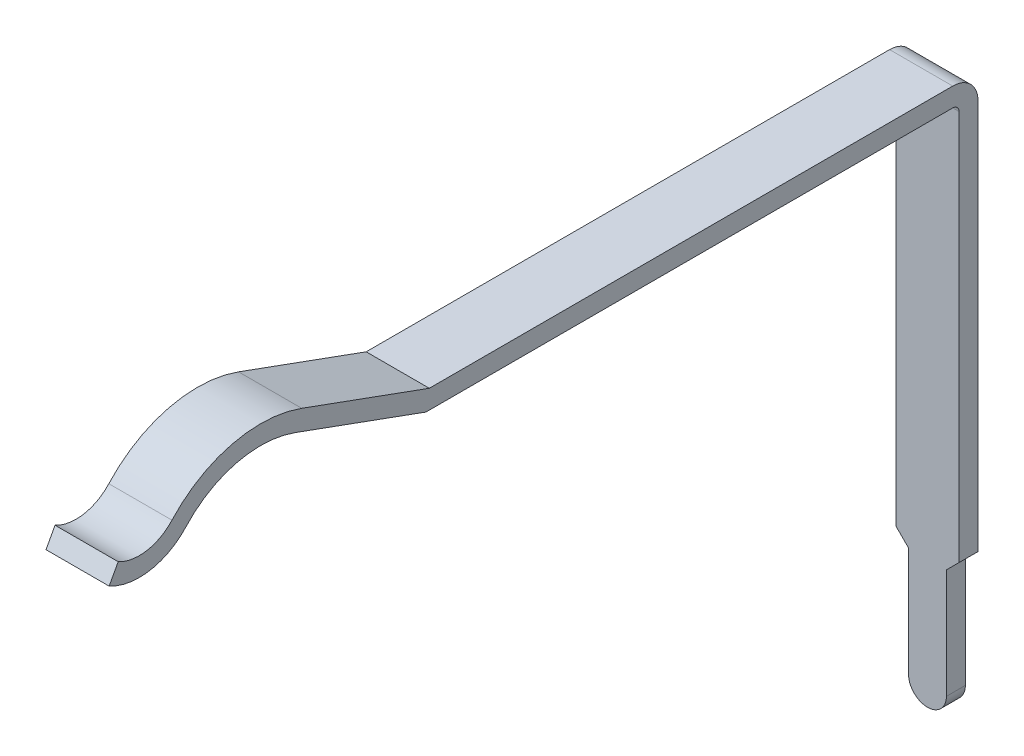
ISO-10303-21;
HEADER;
FILE_DESCRIPTION(('STEP AP214'),'2;1');
FILE_NAME('part.step','',(''),(''),'','','');
FILE_SCHEMA(('AUTOMOTIVE_DESIGN { 1 0 10303 214 1 1 1 1 }'));
ENDSEC;
DATA;
#1=APPLICATION_CONTEXT('core data for automotive mechanical design processes');
#2=APPLICATION_PROTOCOL_DEFINITION('international standard','automotive_design',2000,#1);
#3=PRODUCT_CONTEXT('',#1,'mechanical');
#4=PRODUCT('Part','Part','',(#3));
#5=PRODUCT_RELATED_PRODUCT_CATEGORY('part','',(#4));
#6=PRODUCT_DEFINITION_FORMATION('','',#4);
#7=PRODUCT_DEFINITION_CONTEXT('part definition',#1,'design');
#8=PRODUCT_DEFINITION('design','',#6,#7);
#9=PRODUCT_DEFINITION_SHAPE('','',#8);
#10=(LENGTH_UNIT() NAMED_UNIT(*) SI_UNIT(.MILLI.,.METRE.));
#11=(NAMED_UNIT(*) PLANE_ANGLE_UNIT() SI_UNIT($,.RADIAN.));
#12=(NAMED_UNIT(*) SI_UNIT($,.STERADIAN.) SOLID_ANGLE_UNIT());
#13=UNCERTAINTY_MEASURE_WITH_UNIT(LENGTH_MEASURE(1.E-05),#10,'distance_accuracy_value','');
#14=(GEOMETRIC_REPRESENTATION_CONTEXT(3) GLOBAL_UNCERTAINTY_ASSIGNED_CONTEXT((#13)) GLOBAL_UNIT_ASSIGNED_CONTEXT((#10,
#11,#12)) REPRESENTATION_CONTEXT('',''));
#15=CARTESIAN_POINT('',(0.,0.,0.));
#16=DIRECTION('',(0.,0.,1.));
#17=DIRECTION('',(1.,0.,0.));
#18=AXIS2_PLACEMENT_3D('',#15,#16,#17);
#19=CARTESIAN_POINT('',(0.5,-0.1,-14.36));
#20=DIRECTION('',(-1.,0.,0.));
#21=DIRECTION('',(0.,0.,1.));
#22=AXIS2_PLACEMENT_3D('',#19,#20,#21);
#23=CYLINDRICAL_SURFACE('',#22,0.4);
#24=DIRECTION('',(-1.,0.,0.));
#25=VECTOR('',#24,1.);
#26=CARTESIAN_POINT('',(0.,0.3,-14.36));
#27=LINE('',#26,#25);
#28=CARTESIAN_POINT('',(0.5,0.300000000311151,-14.36));
#29=VERTEX_POINT('',#28);
#30=CARTESIAN_POINT('',(-0.5,0.300000000311151,-14.36));
#31=VERTEX_POINT('',#30);
#32=EDGE_CURVE('E11',#29,#31,#27,.T.);
#33=ORIENTED_EDGE('',*,*,#32,.F.);
#34=CARTESIAN_POINT('',(0.5,-0.1,-14.36));
#35=DIRECTION('',(1.,0.,0.));
#36=DIRECTION('',(0.,0.,1.));
#37=AXIS2_PLACEMENT_3D('',#34,#35,#36);
#38=CIRCLE('',#37,0.4);
#39=CARTESIAN_POINT('',(0.5,-0.1,-14.76));
#40=VERTEX_POINT('',#39);
#41=EDGE_CURVE('E238',#40,#29,#38,.T.);
#42=ORIENTED_EDGE('',*,*,#41,.F.);
#43=DIRECTION('',(1.,0.,0.));
#44=VECTOR('',#43,1.);
#45=CARTESIAN_POINT('',(0.,-0.1,-14.76));
#46=LINE('',#45,#44);
#47=CARTESIAN_POINT('',(-0.5,-0.1,-14.76));
#48=VERTEX_POINT('',#47);
#49=EDGE_CURVE('E276',#48,#40,#46,.T.);
#50=ORIENTED_EDGE('',*,*,#49,.F.);
#51=CARTESIAN_POINT('',(-0.5,-0.1,-14.36));
#52=DIRECTION('',(1.,0.,0.));
#53=DIRECTION('',(0.,0.,1.));
#54=AXIS2_PLACEMENT_3D('',#51,#52,#53);
#55=CIRCLE('',#54,0.4);
#56=EDGE_CURVE('E335',#48,#31,#55,.T.);
#57=ORIENTED_EDGE('',*,*,#56,.T.);
#58=EDGE_LOOP('',(#33,#42,#50,#57));
#59=FACE_BOUND('',#58,.T.);
#60=ADVANCED_FACE('F16',(#59),#23,.T.);
#61=CARTESIAN_POINT('',(-0.5,0.3,-14.36));
#62=DIRECTION('',(0.,1.,0.));
#63=DIRECTION('',(1.,0.,0.));
#64=AXIS2_PLACEMENT_3D('',#61,#62,#63);
#65=PLANE('',#64);
#66=DIRECTION('',(0.,0.,1.));
#67=VECTOR('',#66,1.);
#68=CARTESIAN_POINT('',(0.5,0.300000000622303,-7.83872));
#69=LINE('',#68,#67);
#70=CARTESIAN_POINT('',(0.5,0.300000000466727,-6.07037707311936));
#71=VERTEX_POINT('',#70);
#72=EDGE_CURVE('E233',#29,#71,#69,.T.);
#73=ORIENTED_EDGE('',*,*,#72,.F.);
#74=ORIENTED_EDGE('',*,*,#32,.T.);
#75=DIRECTION('',(0.,0.,1.));
#76=VECTOR('',#75,1.);
#77=CARTESIAN_POINT('',(-0.5,0.300000000622303,-7.83872));
#78=LINE('',#77,#76);
#79=CARTESIAN_POINT('',(-0.5,0.300000000311151,-6.07037706914512));
#80=VERTEX_POINT('',#79);
#81=EDGE_CURVE('E326',#31,#80,#78,.T.);
#82=ORIENTED_EDGE('',*,*,#81,.T.);
#83=DIRECTION('',(-1.,0.,0.));
#84=VECTOR('',#83,1.);
#85=CARTESIAN_POINT('',(0.,0.3,-6.07037707));
#86=LINE('',#85,#84);
#87=EDGE_CURVE('E27',#71,#80,#86,.T.);
#88=ORIENTED_EDGE('',*,*,#87,.F.);
#89=EDGE_LOOP('',(#73,#74,#82,#88));
#90=FACE_BOUND('',#89,.T.);
#91=ADVANCED_FACE('F720',(#90),#65,.T.);
#92=CARTESIAN_POINT('',(-0.5,0.3,-6.07037707));
#93=DIRECTION('',(0.,0.939692620883365,-0.342020143057909));
#94=DIRECTION('',(-1.,0.,0.));
#95=AXIS2_PLACEMENT_3D('',#92,#93,#94);
#96=PLANE('',#95);
#97=DIRECTION('',(0.,0.342020140746785,0.939692621724545));
#98=VECTOR('',#97,1.);
#99=CARTESIAN_POINT('',(0.5,0.300000000622303,-6.07037707623872));
#100=LINE('',#99,#98);
#101=CARTESIAN_POINT('',(0.5,1.03541597897149,-4.04983826915849));
#102=VERTEX_POINT('',#101);
#103=EDGE_CURVE('E237',#71,#102,#100,.T.);
#104=ORIENTED_EDGE('',*,*,#103,.F.);
#105=ORIENTED_EDGE('',*,*,#87,.T.);
#106=DIRECTION('',(0.,0.342020143057909,0.939692620883365));
#107=VECTOR('',#106,1.);
#108=CARTESIAN_POINT('',(-0.5,0.3,-6.07037707));
#109=LINE('',#108,#107);
#110=CARTESIAN_POINT('',(-0.5,1.03541597937978,-4.04983827179352));
#111=VERTEX_POINT('',#110);
#112=EDGE_CURVE('E322',#80,#111,#109,.T.);
#113=ORIENTED_EDGE('',*,*,#112,.T.);
#114=DIRECTION('',(1.,0.,0.));
#115=VECTOR('',#114,1.);
#116=CARTESIAN_POINT('',(0.,1.03541597961914,-4.04983827197282));
#117=LINE('',#116,#115);
#118=EDGE_CURVE('E219',#111,#102,#117,.T.);
#119=ORIENTED_EDGE('',*,*,#118,.T.);
#120=EDGE_LOOP('',(#104,#105,#113,#119));
#121=FACE_BOUND('',#120,.T.);
#122=ADVANCED_FACE('F724',(#121),#96,.T.);
#123=CARTESIAN_POINT('',(0.5,-0.75,-3.4));
#124=DIRECTION('',(-1.,0.,0.));
#125=DIRECTION('',(0.,0.,1.));
#126=AXIS2_PLACEMENT_3D('',#123,#124,#125);
#127=CYLINDRICAL_SURFACE('',#126,1.9);
#128=DIRECTION('',(-1.,0.,0.));
#129=VECTOR('',#128,1.);
#130=CARTESIAN_POINT('',(0.,0.52884615384742,-1.99481228515964));
#131=LINE('',#130,#129);
#132=CARTESIAN_POINT('',(0.5,0.528846153901887,-1.99481228505774));
#133=VERTEX_POINT('',#132);
#134=CARTESIAN_POINT('',(-0.5,0.528846153826487,-1.99481228514059));
#135=VERTEX_POINT('',#134);
#136=EDGE_CURVE('E362',#133,#135,#131,.T.);
#137=ORIENTED_EDGE('',*,*,#136,.F.);
#138=CARTESIAN_POINT('',(0.5,-0.75,-3.4));
#139=DIRECTION('',(1.,0.,0.));
#140=DIRECTION('',(0.,0.,1.));
#141=AXIS2_PLACEMENT_3D('',#138,#139,#140);
#142=CIRCLE('',#141,1.9);
#143=EDGE_CURVE('E242',#102,#133,#142,.T.);
#144=ORIENTED_EDGE('',*,*,#143,.F.);
#145=ORIENTED_EDGE('',*,*,#118,.F.);
#146=CARTESIAN_POINT('',(-0.5,-0.75,-3.4));
#147=DIRECTION('',(1.,0.,0.));
#148=DIRECTION('',(0.,0.,1.));
#149=AXIS2_PLACEMENT_3D('',#146,#147,#148);
#150=CIRCLE('',#149,1.9);
#151=EDGE_CURVE('E20',#111,#135,#150,.T.);
#152=ORIENTED_EDGE('',*,*,#151,.T.);
#153=EDGE_LOOP('',(#137,#144,#145,#152));
#154=FACE_BOUND('',#153,.T.);
#155=ADVANCED_FACE('F758',(#154),#127,.T.);
#156=CARTESIAN_POINT('',(0.5,1.,-1.477111548));
#157=DIRECTION('',(-1.,0.,0.));
#158=DIRECTION('',(0.,0.,1.));
#159=AXIS2_PLACEMENT_3D('',#156,#157,#158);
#160=CYLINDRICAL_SURFACE('',#159,0.7);
#161=CARTESIAN_POINT('',(0.5,1.,-1.477111548));
#162=DIRECTION('',(-1.,0.,0.));
#163=DIRECTION('',(0.,0.,1.));
#164=AXIS2_PLACEMENT_3D('',#161,#162,#163);
#165=CIRCLE('',#164,0.7);
#166=CARTESIAN_POINT('',(0.5,0.38481007960968,-1.14313346157592));
#167=VERTEX_POINT('',#166);
#168=EDGE_CURVE('E215',#133,#167,#165,.T.);
#169=ORIENTED_EDGE('',*,*,#168,.F.);
#170=ORIENTED_EDGE('',*,*,#136,.T.);
#171=CARTESIAN_POINT('',(-0.5,1.,-1.477111548));
#172=DIRECTION('',(-1.,0.,0.));
#173=DIRECTION('',(0.,0.,1.));
#174=AXIS2_PLACEMENT_3D('',#171,#172,#173);
#175=CIRCLE('',#174,0.7);
#176=CARTESIAN_POINT('',(-0.5,0.384810078226828,-1.14313346412314));
#177=VERTEX_POINT('',#176);
#178=EDGE_CURVE('E247',#135,#177,#175,.T.);
#179=ORIENTED_EDGE('',*,*,#178,.T.);
#180=DIRECTION('',(-1.,0.,0.));
#181=VECTOR('',#180,1.);
#182=CARTESIAN_POINT('',(0.,0.384810078,-1.143133464));
#183=LINE('',#182,#181);
#184=EDGE_CURVE('E340',#167,#177,#183,.T.);
#185=ORIENTED_EDGE('',*,*,#184,.F.);
#186=EDGE_LOOP('',(#169,#170,#179,#185));
#187=FACE_BOUND('',#186,.T.);
#188=ADVANCED_FACE('F714',(#187),#160,.F.);
#189=CARTESIAN_POINT('',(-0.5,0.384810078,-1.143133464));
#190=DIRECTION('',(0.,0.477111547746772,0.878842745322893));
#191=DIRECTION('',(1.,0.,0.));
#192=AXIS2_PLACEMENT_3D('',#189,#190,#191);
#193=PLANE('',#192);
#194=DIRECTION('',(0.,-0.878842757719991,0.477111524911232));
#195=VECTOR('',#194,1.);
#196=CARTESIAN_POINT('',(0.5,0.384810080288332,-1.1431334586464));
#197=LINE('',#196,#195);
#198=CARTESIAN_POINT('',(0.5,0.121157254244879,-1.00000000104939));
#199=VERTEX_POINT('',#198);
#200=EDGE_CURVE('E208',#167,#199,#197,.T.);
#201=ORIENTED_EDGE('',*,*,#200,.F.);
#202=ORIENTED_EDGE('',*,*,#184,.T.);
#203=DIRECTION('',(0.,-0.878842745322893,0.477111547746772));
#204=VECTOR('',#203,1.);
#205=CARTESIAN_POINT('',(-0.5,0.384810078,-1.143133464));
#206=LINE('',#205,#204);
#207=CARTESIAN_POINT('',(-0.5,0.121157254721593,-1.00000000017128));
#208=VERTEX_POINT('',#207);
#209=EDGE_CURVE('E243',#177,#208,#206,.T.);
#210=ORIENTED_EDGE('',*,*,#209,.T.);
#211=DIRECTION('',(1.,0.,0.));
#212=VECTOR('',#211,1.);
#213=CARTESIAN_POINT('',(0.,0.121157254586397,-1.00000000042032));
#214=LINE('',#213,#212);
#215=EDGE_CURVE('E193',#208,#199,#214,.T.);
#216=ORIENTED_EDGE('',*,*,#215,.T.);
#217=EDGE_LOOP('',(#201,#202,#210,#216));
#218=FACE_BOUND('',#217,.T.);
#219=ADVANCED_FACE('F710',(#218),#193,.T.);
#220=CARTESIAN_POINT('',(0.5,1.,-1.477111548));
#221=DIRECTION('',(-1.,0.,0.));
#222=DIRECTION('',(0.,0.,1.));
#223=AXIS2_PLACEMENT_3D('',#220,#221,#222);
#224=CYLINDRICAL_SURFACE('',#223,1.);
#225=DIRECTION('',(-1.,0.,0.));
#226=VECTOR('',#225,1.);
#227=CARTESIAN_POINT('',(0.,0.326923076434778,-2.21668402890764));
#228=LINE('',#227,#226);
#229=CARTESIAN_POINT('',(0.5,0.326923076649927,-2.21668402925491));
#230=VERTEX_POINT('',#229);
#231=CARTESIAN_POINT('',(-0.5,0.326923076725327,-2.21668402917207));
#232=VERTEX_POINT('',#231);
#233=EDGE_CURVE('E182',#230,#232,#228,.T.);
#234=ORIENTED_EDGE('',*,*,#233,.F.);
#235=CARTESIAN_POINT('',(0.5,1.,-1.477111548));
#236=DIRECTION('',(1.,0.,0.));
#237=DIRECTION('',(0.,0.,1.));
#238=AXIS2_PLACEMENT_3D('',#235,#236,#237);
#239=CIRCLE('',#238,1.);
#240=EDGE_CURVE('E185',#199,#230,#239,.T.);
#241=ORIENTED_EDGE('',*,*,#240,.F.);
#242=ORIENTED_EDGE('',*,*,#215,.F.);
#243=CARTESIAN_POINT('',(-0.5,1.,-1.477111548));
#244=DIRECTION('',(1.,0.,0.));
#245=DIRECTION('',(0.,0.,1.));
#246=AXIS2_PLACEMENT_3D('',#243,#244,#245);
#247=CIRCLE('',#246,1.);
#248=EDGE_CURVE('E188',#208,#232,#247,.T.);
#249=ORIENTED_EDGE('',*,*,#248,.T.);
#250=EDGE_LOOP('',(#234,#241,#242,#249));
#251=FACE_BOUND('',#250,.T.);
#252=ADVANCED_FACE('F18',(#251),#224,.T.);
#253=CARTESIAN_POINT('',(0.5,-0.75,-3.4));
#254=DIRECTION('',(-1.,0.,0.));
#255=DIRECTION('',(0.,0.,1.));
#256=AXIS2_PLACEMENT_3D('',#253,#254,#255);
#257=CYLINDRICAL_SURFACE('',#256,1.6);
#258=CARTESIAN_POINT('',(0.5,-0.75,-3.4));
#259=DIRECTION('',(-1.,0.,0.));
#260=DIRECTION('',(0.,0.,1.));
#261=AXIS2_PLACEMENT_3D('',#258,#259,#260);
#262=CIRCLE('',#261,1.6);
#263=CARTESIAN_POINT('',(0.5,0.75350819362759,-3.94723223066756));
#264=VERTEX_POINT('',#263);
#265=EDGE_CURVE('E197',#230,#264,#262,.T.);
#266=ORIENTED_EDGE('',*,*,#265,.F.);
#267=ORIENTED_EDGE('',*,*,#233,.T.);
#268=CARTESIAN_POINT('',(-0.5,-0.75,-3.4));
#269=DIRECTION('',(-1.,0.,0.));
#270=DIRECTION('',(0.,0.,1.));
#271=AXIS2_PLACEMENT_3D('',#268,#269,#270);
#272=CIRCLE('',#271,1.6);
#273=CARTESIAN_POINT('',(-0.5,0.753508193021166,-3.94723222894184));
#274=VERTEX_POINT('',#273);
#275=EDGE_CURVE('E254',#232,#274,#272,.T.);
#276=ORIENTED_EDGE('',*,*,#275,.T.);
#277=DIRECTION('',(1.,0.,0.));
#278=VECTOR('',#277,1.);
#279=CARTESIAN_POINT('',(0.,0.753508193,-3.947232229));
#280=LINE('',#279,#278);
#281=EDGE_CURVE('E194',#274,#264,#280,.T.);
#282=ORIENTED_EDGE('',*,*,#281,.T.);
#283=EDGE_LOOP('',(#266,#267,#276,#282));
#284=FACE_BOUND('',#283,.T.);
#285=ADVANCED_FACE('F198',(#284),#257,.F.);
#286=CARTESIAN_POINT('',(-0.5,0.,-6.017478976));
#287=DIRECTION('',(0.,0.939692620858037,-0.342020143127497));
#288=DIRECTION('',(-1.,0.,0.));
#289=AXIS2_PLACEMENT_3D('',#286,#287,#288);
#290=PLANE('',#289);
#291=DIRECTION('',(1.,0.,0.));
#292=VECTOR('',#291,1.);
#293=CARTESIAN_POINT('',(0.,0.,-6.017478976));
#294=LINE('',#293,#292);
#295=CARTESIAN_POINT('',(-0.5,-1.3890104451685E-09,-6.01747897981627));
#296=VERTEX_POINT('',#295);
#297=CARTESIAN_POINT('',(0.5,-1.75888896004374E-09,-6.01747897737994));
#298=VERTEX_POINT('',#297);
#299=EDGE_CURVE('E298',#296,#298,#294,.T.);
#300=ORIENTED_EDGE('',*,*,#299,.T.);
#301=DIRECTION('',(0.,-0.342020144788669,-0.93969262025342));
#302=VECTOR('',#301,1.);
#303=CARTESIAN_POINT('',(0.5,0.753508195005623,-3.94723223027328));
#304=LINE('',#303,#302);
#305=EDGE_CURVE('E203',#264,#298,#304,.T.);
#306=ORIENTED_EDGE('',*,*,#305,.F.);
#307=ORIENTED_EDGE('',*,*,#281,.F.);
#308=DIRECTION('',(0.,-0.342020143127497,-0.939692620858037));
#309=VECTOR('',#308,1.);
#310=CARTESIAN_POINT('',(-0.5,0.,-6.017478976));
#311=LINE('',#310,#309);
#312=EDGE_CURVE('E257',#274,#296,#311,.T.);
#313=ORIENTED_EDGE('',*,*,#312,.T.);
#314=EDGE_LOOP('',(#300,#306,#307,#313));
#315=FACE_BOUND('',#314,.T.);
#316=ADVANCED_FACE('F393',(#315),#290,.F.);
#317=CARTESIAN_POINT('',(-0.5,0.,-14.36));
#318=DIRECTION('',(0.,1.,0.));
#319=DIRECTION('',(1.,0.,0.));
#320=AXIS2_PLACEMENT_3D('',#317,#318,#319);
#321=PLANE('',#320);
#322=DIRECTION('',(-1.,0.,0.));
#323=VECTOR('',#322,1.);
#324=CARTESIAN_POINT('',(0.,0.,-14.3600000000205));
#325=LINE('',#324,#323);
#326=CARTESIAN_POINT('',(0.5,-1.38901065128982E-09,-14.3600000000103));
#327=VERTEX_POINT('',#326);
#328=CARTESIAN_POINT('',(-0.5,-1.38901065128982E-09,-14.3600000000103));
#329=VERTEX_POINT('',#328);
#330=EDGE_CURVE('E227',#327,#329,#325,.T.);
#331=ORIENTED_EDGE('',*,*,#330,.F.);
#332=DIRECTION('',(0.,0.,-1.));
#333=VECTOR('',#332,1.);
#334=CARTESIAN_POINT('',(0.5,-2.77802130257965E-09,-7.83872));
#335=LINE('',#334,#333);
#336=EDGE_CURVE('E232',#298,#327,#335,.T.);
#337=ORIENTED_EDGE('',*,*,#336,.F.);
#338=ORIENTED_EDGE('',*,*,#299,.F.);
#339=DIRECTION('',(0.,0.,-1.));
#340=VECTOR('',#339,1.);
#341=CARTESIAN_POINT('',(-0.5,-2.77802130257965E-09,-7.83872));
#342=LINE('',#341,#340);
#343=EDGE_CURVE('E284',#296,#329,#342,.T.);
#344=ORIENTED_EDGE('',*,*,#343,.T.);
#345=EDGE_LOOP('',(#331,#337,#338,#344));
#346=FACE_BOUND('',#345,.T.);
#347=ADVANCED_FACE('F397',(#346),#321,.F.);
#348=CARTESIAN_POINT('',(0.5,-8.57052,-14.76));
#349=DIRECTION('',(0.,0.,-1.));
#350=DIRECTION('',(0.,-1.,0.));
#351=AXIS2_PLACEMENT_3D('',#348,#349,#350);
#352=PLANE('',#351);
#353=ORIENTED_EDGE('',*,*,#49,.T.);
#354=DIRECTION('',(0.,1.,0.));
#355=VECTOR('',#354,1.);
#356=CARTESIAN_POINT('',(0.5,-2.5453267095,-14.76));
#357=LINE('',#356,#355);
#358=CARTESIAN_POINT('',(0.5,-6.285265009,-14.76));
#359=VERTEX_POINT('',#358);
#360=EDGE_CURVE('E258',#359,#40,#357,.T.);
#361=ORIENTED_EDGE('',*,*,#360,.F.);
#362=DIRECTION('',(-0.707106781186547,-0.707106781186549,0.));
#363=VECTOR('',#362,1.);
#364=CARTESIAN_POINT('',(0.4,-6.385265009,-14.76));
#365=LINE('',#364,#363);
#366=CARTESIAN_POINT('',(0.3,-6.485265009,-14.76));
#367=VERTEX_POINT('',#366);
#368=EDGE_CURVE('E343',#359,#367,#365,.T.);
#369=ORIENTED_EDGE('',*,*,#368,.T.);
#370=DIRECTION('',(0.,-1.,0.));
#371=VECTOR('',#370,1.);
#372=CARTESIAN_POINT('',(0.3,-7.3526325045,-14.76));
#373=LINE('',#372,#371);
#374=CARTESIAN_POINT('',(0.3,-8.22,-14.76));
#375=VERTEX_POINT('',#374);
#376=EDGE_CURVE('E226',#367,#375,#373,.T.);
#377=ORIENTED_EDGE('',*,*,#376,.T.);
#378=CARTESIAN_POINT('',(0.,-8.22,-14.76));
#379=DIRECTION('',(0.,0.,-1.));
#380=DIRECTION('',(0.,-1.,0.));
#381=AXIS2_PLACEMENT_3D('',#378,#379,#380);
#382=CIRCLE('',#381,0.3);
#383=CARTESIAN_POINT('',(0.,-8.52,-14.76));
#384=VERTEX_POINT('',#383);
#385=EDGE_CURVE('E273',#375,#384,#382,.T.);
#386=ORIENTED_EDGE('',*,*,#385,.T.);
#387=CARTESIAN_POINT('',(0.,-8.22,-14.76));
#388=DIRECTION('',(0.,0.,-1.));
#389=DIRECTION('',(0.,-1.,0.));
#390=AXIS2_PLACEMENT_3D('',#387,#388,#389);
#391=CIRCLE('',#390,0.3);
#392=CARTESIAN_POINT('',(-0.3,-8.22,-14.76));
#393=VERTEX_POINT('',#392);
#394=EDGE_CURVE('E277',#384,#393,#391,.T.);
#395=ORIENTED_EDGE('',*,*,#394,.T.);
#396=DIRECTION('',(0.,1.,0.));
#397=VECTOR('',#396,1.);
#398=CARTESIAN_POINT('',(-0.3,-7.3526325045,-14.76));
#399=LINE('',#398,#397);
#400=CARTESIAN_POINT('',(-0.3,-6.485265009,-14.76));
#401=VERTEX_POINT('',#400);
#402=EDGE_CURVE('E42',#393,#401,#399,.T.);
#403=ORIENTED_EDGE('',*,*,#402,.T.);
#404=DIRECTION('',(-0.707106781186547,0.707106781186549,0.));
#405=VECTOR('',#404,1.);
#406=CARTESIAN_POINT('',(-0.4,-6.385265009,-14.76));
#407=LINE('',#406,#405);
#408=CARTESIAN_POINT('',(-0.5,-6.285265009,-14.76));
#409=VERTEX_POINT('',#408);
#410=EDGE_CURVE('E295',#401,#409,#407,.T.);
#411=ORIENTED_EDGE('',*,*,#410,.T.);
#412=DIRECTION('',(0.,1.,0.));
#413=VECTOR('',#412,1.);
#414=CARTESIAN_POINT('',(-0.5,-2.5453267095,-14.76));
#415=LINE('',#414,#413);
#416=EDGE_CURVE('E346',#409,#48,#415,.T.);
#417=ORIENTED_EDGE('',*,*,#416,.T.);
#418=EDGE_LOOP('',(#353,#361,#369,#377,#386,#395,#403,#411,#417));
#419=FACE_BOUND('',#418,.T.);
#420=ADVANCED_FACE('F750',(#419),#352,.T.);
#421=CARTESIAN_POINT('',(0.,-8.22,-14.76));
#422=DIRECTION('',(0.,0.,1.));
#423=DIRECTION('',(0.,-1.,0.));
#424=AXIS2_PLACEMENT_3D('',#421,#422,#423);
#425=CYLINDRICAL_SURFACE('',#424,0.3);
#426=DIRECTION('',(0.,0.,1.));
#427=VECTOR('',#426,1.);
#428=CARTESIAN_POINT('',(0.,-8.52,-14.76));
#429=LINE('',#428,#427);
#430=CARTESIAN_POINT('',(0.,-8.52,-14.46));
#431=VERTEX_POINT('',#430);
#432=EDGE_CURVE('E271',#384,#431,#429,.T.);
#433=ORIENTED_EDGE('',*,*,#432,.F.);
#434=ORIENTED_EDGE('',*,*,#385,.F.);
#435=DIRECTION('',(0.,0.,1.));
#436=VECTOR('',#435,1.);
#437=CARTESIAN_POINT('',(0.3,-8.22,-14.61));
#438=LINE('',#437,#436);
#439=CARTESIAN_POINT('',(0.3,-8.22,-14.46));
#440=VERTEX_POINT('',#439);
#441=EDGE_CURVE('E225',#375,#440,#438,.T.);
#442=ORIENTED_EDGE('',*,*,#441,.T.);
#443=CARTESIAN_POINT('',(0.,-8.22,-14.46));
#444=DIRECTION('',(0.,0.,-1.));
#445=DIRECTION('',(0.,-1.,0.));
#446=AXIS2_PLACEMENT_3D('',#443,#444,#445);
#447=CIRCLE('',#446,0.3);
#448=EDGE_CURVE('E315',#440,#431,#447,.T.);
#449=ORIENTED_EDGE('',*,*,#448,.T.);
#450=EDGE_LOOP('',(#433,#434,#442,#449));
#451=FACE_BOUND('',#450,.T.);
#452=ADVANCED_FACE('F789',(#451),#425,.T.);
#453=CARTESIAN_POINT('',(-0.3,-8.22,-14.46));
#454=DIRECTION('',(1.,0.,0.));
#455=DIRECTION('',(0.,1.,0.));
#456=AXIS2_PLACEMENT_3D('',#453,#454,#455);
#457=PLANE('',#456);
#458=ORIENTED_EDGE('',*,*,#402,.F.);
#459=DIRECTION('',(0.,0.,-1.));
#460=VECTOR('',#459,1.);
#461=CARTESIAN_POINT('',(-0.3,-8.22,-14.61));
#462=LINE('',#461,#460);
#463=CARTESIAN_POINT('',(-0.3,-8.22,-14.46));
#464=VERTEX_POINT('',#463);
#465=EDGE_CURVE('E263',#464,#393,#462,.T.);
#466=ORIENTED_EDGE('',*,*,#465,.F.);
#467=DIRECTION('',(0.,1.,0.));
#468=VECTOR('',#467,1.);
#469=CARTESIAN_POINT('',(-0.3,-4.33526,-14.46));
#470=LINE('',#469,#468);
#471=CARTESIAN_POINT('',(-0.3,-6.485265009,-14.46));
#472=VERTEX_POINT('',#471);
#473=EDGE_CURVE('E288',#464,#472,#470,.T.);
#474=ORIENTED_EDGE('',*,*,#473,.T.);
#475=DIRECTION('',(0.,0.,-1.));
#476=VECTOR('',#475,1.);
#477=CARTESIAN_POINT('',(-0.3,-6.485265009,-14.61));
#478=LINE('',#477,#476);
#479=EDGE_CURVE('E292',#472,#401,#478,.T.);
#480=ORIENTED_EDGE('',*,*,#479,.T.);
#481=EDGE_LOOP('',(#458,#466,#474,#480));
#482=FACE_BOUND('',#481,.T.);
#483=ADVANCED_FACE('F805',(#482),#457,.F.);
#484=CARTESIAN_POINT('',(-0.3,-6.485265009,-14.76));
#485=DIRECTION('',(0.707106781186549,0.707106781186547,0.));
#486=DIRECTION('',(0.,0.,-1.));
#487=AXIS2_PLACEMENT_3D('',#484,#485,#486);
#488=PLANE('',#487);
#489=ORIENTED_EDGE('',*,*,#410,.F.);
#490=ORIENTED_EDGE('',*,*,#479,.F.);
#491=DIRECTION('',(-0.707106781186547,0.707106781186549,0.));
#492=VECTOR('',#491,1.);
#493=CARTESIAN_POINT('',(-0.3,-6.485265009,-14.46));
#494=LINE('',#493,#492);
#495=CARTESIAN_POINT('',(-0.5,-6.285265009,-14.46));
#496=VERTEX_POINT('',#495);
#497=EDGE_CURVE('E252',#472,#496,#494,.T.);
#498=ORIENTED_EDGE('',*,*,#497,.T.);
#499=DIRECTION('',(0.,0.,-1.));
#500=VECTOR('',#499,1.);
#501=CARTESIAN_POINT('',(-0.5,-6.285265009,-7.83872));
#502=LINE('',#501,#500);
#503=EDGE_CURVE('E280',#496,#409,#502,.T.);
#504=ORIENTED_EDGE('',*,*,#503,.T.);
#505=EDGE_LOOP('',(#489,#490,#498,#504));
#506=FACE_BOUND('',#505,.T.);
#507=ADVANCED_FACE('F734',(#506),#488,.F.);
#508=CARTESIAN_POINT('',(-0.5,-6.285265009,-0.91744));
#509=DIRECTION('',(1.,0.,0.));
#510=DIRECTION('',(0.,1.,0.));
#511=AXIS2_PLACEMENT_3D('',#508,#509,#510);
#512=PLANE('',#511);
#513=ORIENTED_EDGE('',*,*,#503,.F.);
#514=DIRECTION('',(0.,1.,0.));
#515=VECTOR('',#514,1.);
#516=CARTESIAN_POINT('',(-0.5,-4.33526,-14.46));
#517=LINE('',#516,#515);
#518=CARTESIAN_POINT('',(-0.5,-0.1,-14.46));
#519=VERTEX_POINT('',#518);
#520=EDGE_CURVE('E248',#496,#519,#517,.T.);
#521=ORIENTED_EDGE('',*,*,#520,.T.);
#522=CARTESIAN_POINT('',(-0.5,-0.1,-14.36));
#523=DIRECTION('',(-1.,0.,0.));
#524=DIRECTION('',(0.,0.,1.));
#525=AXIS2_PLACEMENT_3D('',#522,#523,#524);
#526=CIRCLE('',#525,0.1);
#527=EDGE_CURVE('E231',#329,#519,#526,.T.);
#528=ORIENTED_EDGE('',*,*,#527,.F.);
#529=ORIENTED_EDGE('',*,*,#343,.F.);
#530=ORIENTED_EDGE('',*,*,#312,.F.);
#531=ORIENTED_EDGE('',*,*,#275,.F.);
#532=ORIENTED_EDGE('',*,*,#248,.F.);
#533=ORIENTED_EDGE('',*,*,#209,.F.);
#534=ORIENTED_EDGE('',*,*,#178,.F.);
#535=ORIENTED_EDGE('',*,*,#151,.F.);
#536=ORIENTED_EDGE('',*,*,#112,.F.);
#537=ORIENTED_EDGE('',*,*,#81,.F.);
#538=ORIENTED_EDGE('',*,*,#56,.F.);
#539=ORIENTED_EDGE('',*,*,#416,.F.);
#540=EDGE_LOOP('',(#513,#521,#528,#529,#530,#531,#532,#533,#534,#535,#536,#537,#538,#539));
#541=FACE_BOUND('',#540,.T.);
#542=ADVANCED_FACE('F730',(#541),#512,.F.);
#543=CARTESIAN_POINT('',(0.5,-0.1,-14.36));
#544=DIRECTION('',(-1.,0.,0.));
#545=DIRECTION('',(0.,0.,1.));
#546=AXIS2_PLACEMENT_3D('',#543,#544,#545);
#547=CYLINDRICAL_SURFACE('',#546,0.1);
#548=CARTESIAN_POINT('',(0.5,-0.1,-14.36));
#549=DIRECTION('',(-1.,0.,0.));
#550=DIRECTION('',(0.,0.,1.));
#551=AXIS2_PLACEMENT_3D('',#548,#549,#550);
#552=CIRCLE('',#551,0.1);
#553=CARTESIAN_POINT('',(0.5,-0.1,-14.46));
#554=VERTEX_POINT('',#553);
#555=EDGE_CURVE('E262',#327,#554,#552,.T.);
#556=ORIENTED_EDGE('',*,*,#555,.F.);
#557=ORIENTED_EDGE('',*,*,#330,.T.);
#558=ORIENTED_EDGE('',*,*,#527,.T.);
#559=DIRECTION('',(1.,0.,0.));
#560=VECTOR('',#559,1.);
#561=CARTESIAN_POINT('',(0.,-0.1,-14.46));
#562=LINE('',#561,#560);
#563=EDGE_CURVE('E253',#519,#554,#562,.T.);
#564=ORIENTED_EDGE('',*,*,#563,.T.);
#565=EDGE_LOOP('',(#556,#557,#558,#564));
#566=FACE_BOUND('',#565,.T.);
#567=ADVANCED_FACE('F400',(#566),#547,.F.);
#568=CARTESIAN_POINT('',(0.5,-6.285265009,-0.91744));
#569=DIRECTION('',(1.,0.,0.));
#570=DIRECTION('',(0.,1.,0.));
#571=AXIS2_PLACEMENT_3D('',#568,#569,#570);
#572=PLANE('',#571);
#573=ORIENTED_EDGE('',*,*,#555,.T.);
#574=DIRECTION('',(0.,-1.,0.));
#575=VECTOR('',#574,1.);
#576=CARTESIAN_POINT('',(0.5,-4.33526,-14.46));
#577=LINE('',#576,#575);
#578=CARTESIAN_POINT('',(0.5,-6.285265009,-14.46));
#579=VERTEX_POINT('',#578);
#580=EDGE_CURVE('E359',#554,#579,#577,.T.);
#581=ORIENTED_EDGE('',*,*,#580,.T.);
#582=DIRECTION('',(0.,0.,-1.));
#583=VECTOR('',#582,1.);
#584=CARTESIAN_POINT('',(0.5,-6.285265009,-14.61));
#585=LINE('',#584,#583);
#586=EDGE_CURVE('E305',#579,#359,#585,.T.);
#587=ORIENTED_EDGE('',*,*,#586,.T.);
#588=ORIENTED_EDGE('',*,*,#360,.T.);
#589=ORIENTED_EDGE('',*,*,#41,.T.);
#590=ORIENTED_EDGE('',*,*,#72,.T.);
#591=ORIENTED_EDGE('',*,*,#103,.T.);
#592=ORIENTED_EDGE('',*,*,#143,.T.);
#593=ORIENTED_EDGE('',*,*,#168,.T.);
#594=ORIENTED_EDGE('',*,*,#200,.T.);
#595=ORIENTED_EDGE('',*,*,#240,.T.);
#596=ORIENTED_EDGE('',*,*,#265,.T.);
#597=ORIENTED_EDGE('',*,*,#305,.T.);
#598=ORIENTED_EDGE('',*,*,#336,.T.);
#599=EDGE_LOOP('',(#573,#581,#587,#588,#589,#590,#591,#592,#593,#594,#595,#596,#597,#598));
#600=FACE_BOUND('',#599,.T.);
#601=ADVANCED_FACE('F205',(#600),#572,.T.);
#602=CARTESIAN_POINT('',(0.5,-6.285265009,-14.76));
#603=DIRECTION('',(-0.707106781186549,0.707106781186547,0.));
#604=DIRECTION('',(0.,0.,1.));
#605=AXIS2_PLACEMENT_3D('',#602,#603,#604);
#606=PLANE('',#605);
#607=ORIENTED_EDGE('',*,*,#368,.F.);
#608=ORIENTED_EDGE('',*,*,#586,.F.);
#609=DIRECTION('',(-0.707106781186547,-0.707106781186549,0.));
#610=VECTOR('',#609,1.);
#611=CARTESIAN_POINT('',(0.5,-6.285265009,-14.46));
#612=LINE('',#611,#610);
#613=CARTESIAN_POINT('',(0.3,-6.485265009,-14.46));
#614=VERTEX_POINT('',#613);
#615=EDGE_CURVE('E267',#579,#614,#612,.T.);
#616=ORIENTED_EDGE('',*,*,#615,.T.);
#617=DIRECTION('',(0.,0.,-1.));
#618=VECTOR('',#617,1.);
#619=CARTESIAN_POINT('',(0.3,-6.485265009,-14.61));
#620=LINE('',#619,#618);
#621=EDGE_CURVE('E221',#614,#367,#620,.T.);
#622=ORIENTED_EDGE('',*,*,#621,.T.);
#623=EDGE_LOOP('',(#607,#608,#616,#622));
#624=FACE_BOUND('',#623,.T.);
#625=ADVANCED_FACE('F410',(#624),#606,.F.);
#626=CARTESIAN_POINT('',(0.3,-6.485265009,-14.76));
#627=DIRECTION('',(-1.,0.,0.));
#628=DIRECTION('',(0.,0.,1.));
#629=AXIS2_PLACEMENT_3D('',#626,#627,#628);
#630=PLANE('',#629);
#631=ORIENTED_EDGE('',*,*,#376,.F.);
#632=ORIENTED_EDGE('',*,*,#621,.F.);
#633=DIRECTION('',(0.,-1.,0.));
#634=VECTOR('',#633,1.);
#635=CARTESIAN_POINT('',(0.3,-4.33526,-14.46));
#636=LINE('',#635,#634);
#637=EDGE_CURVE('E311',#614,#440,#636,.T.);
#638=ORIENTED_EDGE('',*,*,#637,.T.);
#639=ORIENTED_EDGE('',*,*,#441,.F.);
#640=EDGE_LOOP('',(#631,#632,#638,#639));
#641=FACE_BOUND('',#640,.T.);
#642=ADVANCED_FACE('F743',(#641),#630,.F.);
#643=CARTESIAN_POINT('',(0.5,-8.57052,-14.46));
#644=DIRECTION('',(0.,0.,-1.));
#645=DIRECTION('',(0.,-1.,0.));
#646=AXIS2_PLACEMENT_3D('',#643,#644,#645);
#647=PLANE('',#646);
#648=ORIENTED_EDGE('',*,*,#615,.F.);
#649=ORIENTED_EDGE('',*,*,#580,.F.);
#650=ORIENTED_EDGE('',*,*,#563,.F.);
#651=ORIENTED_EDGE('',*,*,#520,.F.);
#652=ORIENTED_EDGE('',*,*,#497,.F.);
#653=ORIENTED_EDGE('',*,*,#473,.F.);
#654=CARTESIAN_POINT('',(0.,-8.22,-14.46));
#655=DIRECTION('',(0.,0.,-1.));
#656=DIRECTION('',(0.,-1.,0.));
#657=AXIS2_PLACEMENT_3D('',#654,#655,#656);
#658=CIRCLE('',#657,0.3);
#659=EDGE_CURVE('E268',#431,#464,#658,.T.);
#660=ORIENTED_EDGE('',*,*,#659,.F.);
#661=ORIENTED_EDGE('',*,*,#448,.F.);
#662=ORIENTED_EDGE('',*,*,#637,.F.);
#663=EDGE_LOOP('',(#648,#649,#650,#651,#652,#653,#660,#661,#662));
#664=FACE_BOUND('',#663,.T.);
#665=ADVANCED_FACE('F407',(#664),#647,.F.);
#666=CARTESIAN_POINT('',(0.,-8.22,-14.76));
#667=DIRECTION('',(0.,0.,1.));
#668=DIRECTION('',(0.,-1.,0.));
#669=AXIS2_PLACEMENT_3D('',#666,#667,#668);
#670=CYLINDRICAL_SURFACE('',#669,0.3);
#671=ORIENTED_EDGE('',*,*,#394,.F.);
#672=ORIENTED_EDGE('',*,*,#432,.T.);
#673=ORIENTED_EDGE('',*,*,#659,.T.);
#674=ORIENTED_EDGE('',*,*,#465,.T.);
#675=EDGE_LOOP('',(#671,#672,#673,#674));
#676=FACE_BOUND('',#675,.T.);
#677=ADVANCED_FACE('F571',(#676),#670,.T.);
#678=CLOSED_SHELL('',(#60,#91,#122,#155,#188,#219,#252,#285,#316,#347,#420,#452,#483,#507,#542,
#567,#601,#625,#642,#665,#677));
#679=MANIFOLD_SOLID_BREP('B1',#678);
#680=ADVANCED_BREP_SHAPE_REPRESENTATION('',(#18,#679),#14);
#681=SHAPE_DEFINITION_REPRESENTATION(#9,#680);
ENDSEC;
END-ISO-10303-21;
